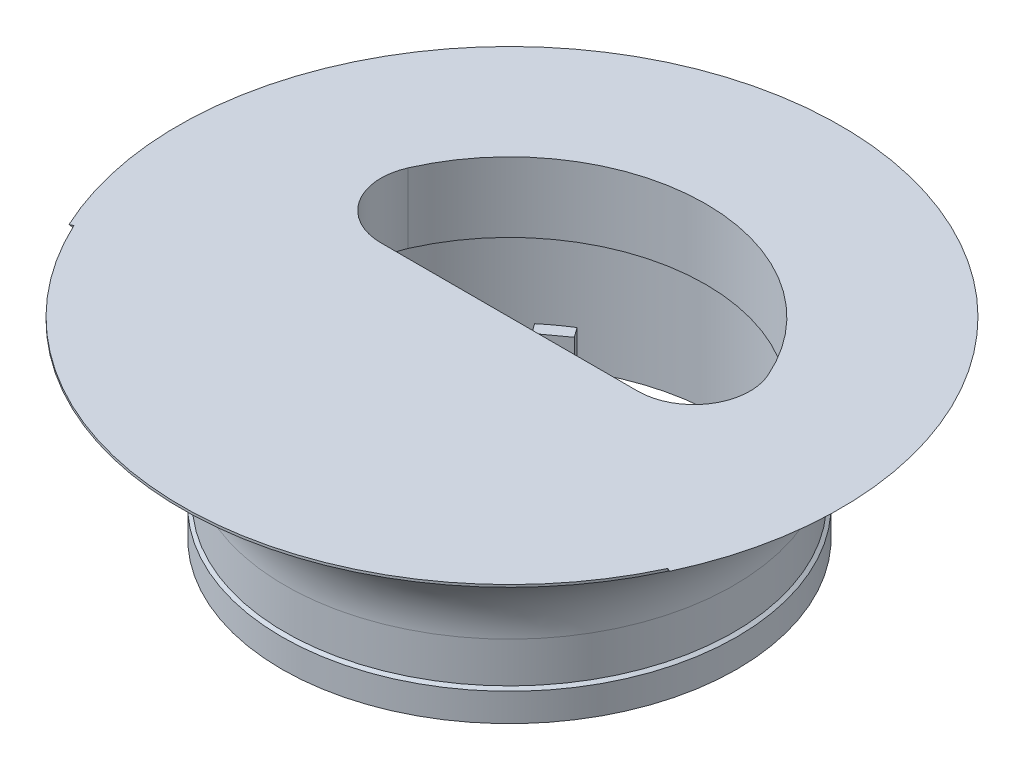
ISO-10303-21;
HEADER;
FILE_DESCRIPTION(('STEP AP214'),'2;1');
FILE_NAME('part.step','',(''),(''),'','','');
FILE_SCHEMA(('AUTOMOTIVE_DESIGN { 1 0 10303 214 1 1 1 1 }'));
ENDSEC;
DATA;
#1=APPLICATION_CONTEXT('core data for automotive mechanical design processes');
#2=APPLICATION_PROTOCOL_DEFINITION('international standard','automotive_design',2000,#1);
#3=PRODUCT_CONTEXT('',#1,'mechanical');
#4=PRODUCT('Part','Part','',(#3));
#5=PRODUCT_RELATED_PRODUCT_CATEGORY('part','',(#4));
#6=PRODUCT_DEFINITION_FORMATION('','',#4);
#7=PRODUCT_DEFINITION_CONTEXT('part definition',#1,'design');
#8=PRODUCT_DEFINITION('design','',#6,#7);
#9=PRODUCT_DEFINITION_SHAPE('','',#8);
#10=(LENGTH_UNIT() NAMED_UNIT(*) SI_UNIT(.MILLI.,.METRE.));
#11=(NAMED_UNIT(*) PLANE_ANGLE_UNIT() SI_UNIT($,.RADIAN.));
#12=(NAMED_UNIT(*) SI_UNIT($,.STERADIAN.) SOLID_ANGLE_UNIT());
#13=UNCERTAINTY_MEASURE_WITH_UNIT(LENGTH_MEASURE(1.E-05),#10,'distance_accuracy_value','');
#14=(GEOMETRIC_REPRESENTATION_CONTEXT(3) GLOBAL_UNCERTAINTY_ASSIGNED_CONTEXT((#13)) GLOBAL_UNIT_ASSIGNED_CONTEXT((#10,
#11,#12)) REPRESENTATION_CONTEXT('',''));
#15=CARTESIAN_POINT('',(0.,0.,0.));
#16=DIRECTION('',(0.,0.,1.));
#17=DIRECTION('',(1.,0.,0.));
#18=AXIS2_PLACEMENT_3D('',#15,#16,#17);
#19=CARTESIAN_POINT('',(0.,20.46905774355,0.));
#20=DIRECTION('',(0.,1.,0.));
#21=DIRECTION('',(0.,0.,1.));
#22=AXIS2_PLACEMENT_3D('',#19,#20,#21);
#23=PLANE('',#22);
#24=DIRECTION('',(-0.906307787036651,0.,-0.422618261740697));
#25=VECTOR('',#24,1.);
#26=CARTESIAN_POINT('',(0.,20.46905774355,0.));
#27=LINE('',#26,#25);
#28=CARTESIAN_POINT('',(32.1378013524586,20.46905774355,14.9861028869154));
#29=VERTEX_POINT('',#28);
#30=CARTESIAN_POINT('',(31.7794250088725,20.46905774355,14.8189892533996));
#31=VERTEX_POINT('',#30);
#32=EDGE_CURVE('E242',#29,#31,#27,.T.);
#33=ORIENTED_EDGE('',*,*,#32,.F.);
#34=CARTESIAN_POINT('',(0.,20.46905774355,0.));
#35=DIRECTION('',(0.,-1.,0.));
#36=DIRECTION('',(0.,0.,-1.));
#37=AXIS2_PLACEMENT_3D('',#34,#35,#36);
#38=CIRCLE('',#37,35.4601403763057);
#39=CARTESIAN_POINT('',(-32.1378013524586,20.46905774355,14.9861028869154));
#40=VERTEX_POINT('',#39);
#41=EDGE_CURVE('E257',#40,#29,#38,.T.);
#42=ORIENTED_EDGE('',*,*,#41,.F.);
#43=DIRECTION('',(0.906307787036651,0.,-0.422618261740697));
#44=VECTOR('',#43,1.);
#45=CARTESIAN_POINT('',(0.,20.46905774355,0.));
#46=LINE('',#45,#44);
#47=CARTESIAN_POINT('',(-31.7794250088725,20.46905774355,14.8189892533996));
#48=VERTEX_POINT('',#47);
#49=EDGE_CURVE('E281',#40,#48,#46,.T.);
#50=ORIENTED_EDGE('',*,*,#49,.T.);
#51=CARTESIAN_POINT('',(0.,20.46905774355,0.));
#52=DIRECTION('',(0.,1.,0.));
#53=DIRECTION('',(0.,0.,1.));
#54=AXIS2_PLACEMENT_3D('',#51,#52,#53);
#55=CIRCLE('',#54,35.0647158321143);
#56=EDGE_CURVE('E259',#48,#31,#55,.T.);
#57=ORIENTED_EDGE('',*,*,#56,.T.);
#58=EDGE_LOOP('',(#33,#42,#50,#57));
#59=FACE_BOUND('',#58,.T.);
#60=DIRECTION('',(-1.,0.,0.));
#61=VECTOR('',#60,1.);
#62=CARTESIAN_POINT('',(21.,20.46905774355,0.));
#63=LINE('',#62,#61);
#64=CARTESIAN_POINT('',(13.7477270848675,20.46905774355,0.));
#65=VERTEX_POINT('',#64);
#66=CARTESIAN_POINT('',(-13.7477270848675,20.46905774355,0.));
#67=VERTEX_POINT('',#66);
#68=EDGE_CURVE('E262',#65,#67,#63,.T.);
#69=ORIENTED_EDGE('',*,*,#68,.T.);
#70=CARTESIAN_POINT('',(-13.7477270848675,20.46905774355,-6.));
#71=DIRECTION('',(0.,1.,0.));
#72=DIRECTION('',(0.,0.,1.));
#73=AXIS2_PLACEMENT_3D('',#70,#71,#72);
#74=CIRCLE('',#73,6.);
#75=CARTESIAN_POINT('',(-19.2468179188145,20.46905774355,-8.4));
#76=VERTEX_POINT('',#75);
#77=EDGE_CURVE('E288',#67,#76,#74,.F.);
#78=ORIENTED_EDGE('',*,*,#77,.T.);
#79=CARTESIAN_POINT('',(0.,20.46905774355,0.));
#80=DIRECTION('',(0.,1.,0.));
#81=DIRECTION('',(0.,0.,1.));
#82=AXIS2_PLACEMENT_3D('',#79,#80,#81);
#83=CIRCLE('',#82,21.);
#84=CARTESIAN_POINT('',(19.2468179188145,20.46905774355,-8.4));
#85=VERTEX_POINT('',#84);
#86=EDGE_CURVE('E285',#76,#85,#83,.F.);
#87=ORIENTED_EDGE('',*,*,#86,.T.);
#88=CARTESIAN_POINT('',(13.7477270848675,20.46905774355,-6.));
#89=DIRECTION('',(0.,1.,0.));
#90=DIRECTION('',(0.,0.,1.));
#91=AXIS2_PLACEMENT_3D('',#88,#89,#90);
#92=CIRCLE('',#91,6.);
#93=EDGE_CURVE('E65',#85,#65,#92,.F.);
#94=ORIENTED_EDGE('',*,*,#93,.T.);
#95=EDGE_LOOP('',(#69,#78,#87,#94));
#96=FACE_BOUND('',#95,.T.);
#97=ADVANCED_FACE('F62',(#59,#96),#23,.T.);
#98=CARTESIAN_POINT('',(21.,73.,0.));
#99=DIRECTION('',(0.,0.,1.));
#100=DIRECTION('',(1.,0.,0.));
#101=AXIS2_PLACEMENT_3D('',#98,#99,#100);
#102=PLANE('',#101);
#103=ORIENTED_EDGE('',*,*,#68,.F.);
#104=DIRECTION('',(0.,1.,0.));
#105=VECTOR('',#104,1.);
#106=CARTESIAN_POINT('',(13.7477270848675,13.,0.));
#107=LINE('',#106,#105);
#108=CARTESIAN_POINT('',(13.7477270848675,13.,0.));
#109=VERTEX_POINT('',#108);
#110=EDGE_CURVE('E303',#65,#109,#107,.F.);
#111=ORIENTED_EDGE('',*,*,#110,.T.);
#112=DIRECTION('',(-1.,0.,0.));
#113=VECTOR('',#112,1.);
#114=CARTESIAN_POINT('',(21.,13.,0.));
#115=LINE('',#114,#113);
#116=CARTESIAN_POINT('',(-13.7477270848675,13.,0.));
#117=VERTEX_POINT('',#116);
#118=EDGE_CURVE('E313',#109,#117,#115,.T.);
#119=ORIENTED_EDGE('',*,*,#118,.T.);
#120=DIRECTION('',(0.,1.,0.));
#121=VECTOR('',#120,1.);
#122=CARTESIAN_POINT('',(-13.7477270848675,58.4278760968654,0.));
#123=LINE('',#122,#121);
#124=EDGE_CURVE('E309',#117,#67,#123,.T.);
#125=ORIENTED_EDGE('',*,*,#124,.T.);
#126=EDGE_LOOP('',(#103,#111,#119,#125));
#127=FACE_BOUND('',#126,.T.);
#128=ADVANCED_FACE('F311',(#127),#102,.F.);
#129=CARTESIAN_POINT('',(0.,73.,0.));
#130=DIRECTION('',(0.,-1.,0.));
#131=DIRECTION('',(0.,0.,-1.));
#132=AXIS2_PLACEMENT_3D('',#129,#130,#131);
#133=CYLINDRICAL_SURFACE('',#132,21.);
#134=ORIENTED_EDGE('',*,*,#86,.F.);
#135=DIRECTION('',(0.,-1.,0.));
#136=VECTOR('',#135,1.);
#137=CARTESIAN_POINT('',(-19.2468179188145,73.,-8.4));
#138=LINE('',#137,#136);
#139=CARTESIAN_POINT('',(-19.2468179188145,13.,-8.4));
#140=VERTEX_POINT('',#139);
#141=EDGE_CURVE('E308',#76,#140,#138,.T.);
#142=ORIENTED_EDGE('',*,*,#141,.T.);
#143=CARTESIAN_POINT('',(0.,13.,0.));
#144=DIRECTION('',(0.,-1.,0.));
#145=DIRECTION('',(0.,0.,1.));
#146=AXIS2_PLACEMENT_3D('',#143,#144,#145);
#147=CIRCLE('',#146,21.);
#148=CARTESIAN_POINT('',(19.2468179188145,13.,-8.4));
#149=VERTEX_POINT('',#148);
#150=EDGE_CURVE('E380',#140,#149,#147,.T.);
#151=ORIENTED_EDGE('',*,*,#150,.T.);
#152=DIRECTION('',(0.,-1.,0.));
#153=VECTOR('',#152,1.);
#154=CARTESIAN_POINT('',(19.2468179188145,73.,-8.4));
#155=LINE('',#154,#153);
#156=EDGE_CURVE('E302',#149,#85,#155,.F.);
#157=ORIENTED_EDGE('',*,*,#156,.T.);
#158=EDGE_LOOP('',(#134,#142,#151,#157));
#159=FACE_BOUND('',#158,.T.);
#160=ADVANCED_FACE('F603',(#159),#133,.F.);
#161=CARTESIAN_POINT('',(0.,0.,0.));
#162=DIRECTION('',(0.,-1.,0.));
#163=DIRECTION('',(0.,0.,-1.));
#164=AXIS2_PLACEMENT_3D('',#161,#162,#163);
#165=CYLINDRICAL_SURFACE('',#164,35.0647158321143);
#166=ORIENTED_EDGE('',*,*,#56,.F.);
#167=DIRECTION('',(0.,-1.,0.));
#168=VECTOR('',#167,1.);
#169=CARTESIAN_POINT('',(-31.7794250088725,55.4278760968653,14.8189892533996));
#170=LINE('',#169,#168);
#171=CARTESIAN_POINT('',(-31.7794250088725,20.2113428590195,14.8189892533996));
#172=VERTEX_POINT('',#171);
#173=EDGE_CURVE('E330',#48,#172,#170,.T.);
#174=ORIENTED_EDGE('',*,*,#173,.T.);
#175=CARTESIAN_POINT('',(0.,20.2113428590195,0.));
#176=DIRECTION('',(0.,1.,0.));
#177=DIRECTION('',(0.,0.,1.));
#178=AXIS2_PLACEMENT_3D('',#175,#176,#177);
#179=CIRCLE('',#178,35.0647158321143);
#180=CARTESIAN_POINT('',(31.7794250088725,20.2113428590195,14.8189892533996));
#181=VERTEX_POINT('',#180);
#182=EDGE_CURVE('E250',#172,#181,#179,.T.);
#183=ORIENTED_EDGE('',*,*,#182,.T.);
#184=DIRECTION('',(0.,-1.,0.));
#185=VECTOR('',#184,1.);
#186=CARTESIAN_POINT('',(31.7794250088725,55.4278760968653,14.8189892533996));
#187=LINE('',#186,#185);
#188=EDGE_CURVE('E243',#31,#181,#187,.T.);
#189=ORIENTED_EDGE('',*,*,#188,.F.);
#190=EDGE_LOOP('',(#166,#174,#183,#189));
#191=FACE_BOUND('',#190,.T.);
#192=ADVANCED_FACE('F609',(#191),#165,.T.);
#193=CARTESIAN_POINT('',(0.,0.,0.));
#194=DIRECTION('',(-0.422618261740697,0.,0.906307787036651));
#195=DIRECTION('',(0.906307787036651,0.,0.422618261740697));
#196=AXIS2_PLACEMENT_3D('',#193,#194,#195);
#197=PLANE('',#196);
#198=DIRECTION('',(0.759282936681099,0.54601403763057,0.354059448080811));
#199=VECTOR('',#198,1.);
#200=CARTESIAN_POINT('',(0.,-2.64181414529798,0.));
#201=LINE('',#200,#199);
#202=EDGE_CURVE('E239',#29,#181,#201,.F.);
#203=ORIENTED_EDGE('',*,*,#202,.F.);
#204=ORIENTED_EDGE('',*,*,#32,.T.);
#205=ORIENTED_EDGE('',*,*,#188,.T.);
#206=EDGE_LOOP('',(#203,#204,#205));
#207=FACE_BOUND('',#206,.T.);
#208=ADVANCED_FACE('F241',(#207),#197,.T.);
#209=CARTESIAN_POINT('',(0.,0.,0.));
#210=DIRECTION('',(-0.422618261740697,0.,-0.906307787036651));
#211=DIRECTION('',(-0.906307787036651,0.,0.422618261740697));
#212=AXIS2_PLACEMENT_3D('',#209,#210,#211);
#213=PLANE('',#212);
#214=ORIENTED_EDGE('',*,*,#49,.F.);
#215=DIRECTION('',(-0.759282936681099,0.54601403763057,0.354059448080811));
#216=VECTOR('',#215,1.);
#217=CARTESIAN_POINT('',(0.,-2.64181414529798,0.));
#218=LINE('',#217,#216);
#219=EDGE_CURVE('E249',#40,#172,#218,.F.);
#220=ORIENTED_EDGE('',*,*,#219,.T.);
#221=ORIENTED_EDGE('',*,*,#173,.F.);
#222=EDGE_LOOP('',(#214,#220,#221));
#223=FACE_BOUND('',#222,.T.);
#224=ADVANCED_FACE('F622',(#223),#213,.F.);
#225=CARTESIAN_POINT('',(-13.7477270848675,73.,-6.));
#226=DIRECTION('',(0.,-1.,0.));
#227=DIRECTION('',(0.,0.,-1.));
#228=AXIS2_PLACEMENT_3D('',#225,#226,#227);
#229=CYLINDRICAL_SURFACE('',#228,6.);
#230=ORIENTED_EDGE('',*,*,#77,.F.);
#231=ORIENTED_EDGE('',*,*,#124,.F.);
#232=CARTESIAN_POINT('',(-13.7477270848675,13.,-6.));
#233=DIRECTION('',(0.,-1.,0.));
#234=DIRECTION('',(0.,0.,-1.));
#235=AXIS2_PLACEMENT_3D('',#232,#233,#234);
#236=CIRCLE('',#235,6.);
#237=EDGE_CURVE('E317',#140,#117,#236,.F.);
#238=ORIENTED_EDGE('',*,*,#237,.F.);
#239=ORIENTED_EDGE('',*,*,#141,.F.);
#240=EDGE_LOOP('',(#230,#231,#238,#239));
#241=FACE_BOUND('',#240,.T.);
#242=ADVANCED_FACE('F619',(#241),#229,.F.);
#243=CARTESIAN_POINT('',(13.7477270848675,73.,-6.));
#244=DIRECTION('',(0.,-1.,0.));
#245=DIRECTION('',(0.,0.,-1.));
#246=AXIS2_PLACEMENT_3D('',#243,#244,#245);
#247=CYLINDRICAL_SURFACE('',#246,6.);
#248=ORIENTED_EDGE('',*,*,#93,.F.);
#249=ORIENTED_EDGE('',*,*,#156,.F.);
#250=CARTESIAN_POINT('',(13.7477270848675,13.,-6.));
#251=DIRECTION('',(0.,-1.,0.));
#252=DIRECTION('',(0.,0.,-1.));
#253=AXIS2_PLACEMENT_3D('',#250,#251,#252);
#254=CIRCLE('',#253,6.);
#255=EDGE_CURVE('E261',#109,#149,#254,.F.);
#256=ORIENTED_EDGE('',*,*,#255,.F.);
#257=ORIENTED_EDGE('',*,*,#110,.F.);
#258=EDGE_LOOP('',(#248,#249,#256,#257));
#259=FACE_BOUND('',#258,.T.);
#260=ADVANCED_FACE('F300',(#259),#247,.F.);
#261=CARTESIAN_POINT('',(0.,0.,0.));
#262=DIRECTION('',(0.,-1.,0.));
#263=DIRECTION('',(0.,0.,-1.));
#264=AXIS2_PLACEMENT_3D('',#261,#262,#263);
#265=CYLINDRICAL_SURFACE('',#264,22.5);
#266=CARTESIAN_POINT('',(0.,12.5,0.));
#267=DIRECTION('',(0.,-1.,0.));
#268=DIRECTION('',(0.,0.,-1.));
#269=AXIS2_PLACEMENT_3D('',#266,#267,#268);
#270=CIRCLE('',#269,22.5);
#271=CARTESIAN_POINT('',(0.,12.5,-22.5));
#272=VERTEX_POINT('',#271);
#273=EDGE_CURVE('E277',#272,#272,#270,.T.);
#274=ORIENTED_EDGE('',*,*,#273,.F.);
#275=EDGE_LOOP('',(#274));
#276=FACE_BOUND('',#275,.T.);
#277=DIRECTION('',(0.,-1.,0.));
#278=VECTOR('',#277,1.);
#279=CARTESIAN_POINT('',(21.845042742334,0.,5.38925853764709));
#280=LINE('',#279,#278);
#281=CARTESIAN_POINT('',(21.845042742334,0.,5.38925853764709));
#282=VERTEX_POINT('',#281);
#283=CARTESIAN_POINT('',(21.845042742334,4.,5.38925853764709));
#284=VERTEX_POINT('',#283);
#285=EDGE_CURVE('E533',#282,#284,#280,.F.);
#286=ORIENTED_EDGE('',*,*,#285,.T.);
#287=CARTESIAN_POINT('',(0.,4.,0.));
#288=DIRECTION('',(0.,-1.,0.));
#289=DIRECTION('',(0.,0.,-1.));
#290=AXIS2_PLACEMENT_3D('',#287,#288,#289);
#291=CIRCLE('',#290,22.5);
#292=CARTESIAN_POINT('',(20.8407375106154,4.,8.48019221560633));
#293=VERTEX_POINT('',#292);
#294=EDGE_CURVE('E327',#284,#293,#291,.T.);
#295=ORIENTED_EDGE('',*,*,#294,.T.);
#296=DIRECTION('',(0.,-1.,0.));
#297=VECTOR('',#296,1.);
#298=CARTESIAN_POINT('',(20.8407375106154,0.,8.48019221560633));
#299=LINE('',#298,#297);
#300=CARTESIAN_POINT('',(20.8407375106154,0.,8.48019221560633));
#301=VERTEX_POINT('',#300);
#302=EDGE_CURVE('E530',#293,#301,#299,.T.);
#303=ORIENTED_EDGE('',*,*,#302,.T.);
#304=CARTESIAN_POINT('',(0.,0.,0.));
#305=DIRECTION('',(0.,-1.,0.));
#306=DIRECTION('',(0.,0.,-1.));
#307=AXIS2_PLACEMENT_3D('',#304,#305,#306);
#308=CIRCLE('',#307,22.5);
#309=CARTESIAN_POINT('',(1.625,0.,22.4412427240561));
#310=VERTEX_POINT('',#309);
#311=EDGE_CURVE('E377',#301,#310,#308,.T.);
#312=ORIENTED_EDGE('',*,*,#311,.T.);
#313=DIRECTION('',(0.,-1.,0.));
#314=VECTOR('',#313,1.);
#315=CARTESIAN_POINT('',(1.625,0.,22.4412427240561));
#316=LINE('',#315,#314);
#317=CARTESIAN_POINT('',(1.625,4.,22.4412427240561));
#318=VERTEX_POINT('',#317);
#319=EDGE_CURVE('E389',#310,#318,#316,.F.);
#320=ORIENTED_EDGE('',*,*,#319,.T.);
#321=CARTESIAN_POINT('',(0.,4.,0.));
#322=DIRECTION('',(0.,-1.,0.));
#323=DIRECTION('',(0.,0.,-1.));
#324=AXIS2_PLACEMENT_3D('',#321,#322,#323);
#325=CIRCLE('',#324,22.5);
#326=CARTESIAN_POINT('',(-1.625,4.,22.4412427240561));
#327=VERTEX_POINT('',#326);
#328=EDGE_CURVE('E352',#318,#327,#325,.T.);
#329=ORIENTED_EDGE('',*,*,#328,.T.);
#330=DIRECTION('',(0.,-1.,0.));
#331=VECTOR('',#330,1.);
#332=CARTESIAN_POINT('',(-1.625,0.,22.4412427240561));
#333=LINE('',#332,#331);
#334=CARTESIAN_POINT('',(-1.625,0.,22.4412427240561));
#335=VERTEX_POINT('',#334);
#336=EDGE_CURVE('E333',#327,#335,#333,.T.);
#337=ORIENTED_EDGE('',*,*,#336,.T.);
#338=CARTESIAN_POINT('',(-20.8407375106155,0.,8.48019221560603));
#339=VERTEX_POINT('',#338);
#340=EDGE_CURVE('E373',#335,#339,#308,.T.);
#341=ORIENTED_EDGE('',*,*,#340,.T.);
#342=DIRECTION('',(0.,-1.,0.));
#343=VECTOR('',#342,1.);
#344=CARTESIAN_POINT('',(-20.8407375106155,0.,8.48019221560603));
#345=LINE('',#344,#343);
#346=CARTESIAN_POINT('',(-20.8407375106155,4.,8.48019221560603));
#347=VERTEX_POINT('',#346);
#348=EDGE_CURVE('E425',#339,#347,#345,.F.);
#349=ORIENTED_EDGE('',*,*,#348,.T.);
#350=CARTESIAN_POINT('',(0.,4.,0.));
#351=DIRECTION('',(0.,-1.,0.));
#352=DIRECTION('',(0.,0.,-1.));
#353=AXIS2_PLACEMENT_3D('',#350,#351,#352);
#354=CIRCLE('',#353,22.5);
#355=CARTESIAN_POINT('',(-21.845042742334,4.,5.38925853764678));
#356=VERTEX_POINT('',#355);
#357=EDGE_CURVE('E349',#347,#356,#354,.T.);
#358=ORIENTED_EDGE('',*,*,#357,.T.);
#359=DIRECTION('',(0.,-1.,0.));
#360=VECTOR('',#359,1.);
#361=CARTESIAN_POINT('',(-21.845042742334,0.,5.38925853764678));
#362=LINE('',#361,#360);
#363=CARTESIAN_POINT('',(-21.845042742334,0.,5.38925853764678));
#364=VERTEX_POINT('',#363);
#365=EDGE_CURVE('E422',#356,#364,#362,.T.);
#366=ORIENTED_EDGE('',*,*,#365,.T.);
#367=CARTESIAN_POINT('',(-14.5052841321751,0.,-17.2001957036793));
#368=VERTEX_POINT('',#367);
#369=EDGE_CURVE('E376',#364,#368,#308,.T.);
#370=ORIENTED_EDGE('',*,*,#369,.T.);
#371=DIRECTION('',(0.,-1.,0.));
#372=VECTOR('',#371,1.);
#373=CARTESIAN_POINT('',(-14.5052841321751,0.,-17.2001957036793));
#374=LINE('',#373,#372);
#375=CARTESIAN_POINT('',(-14.5052841321751,4.,-17.2001957036793));
#376=VERTEX_POINT('',#375);
#377=EDGE_CURVE('E461',#368,#376,#374,.F.);
#378=ORIENTED_EDGE('',*,*,#377,.T.);
#379=CARTESIAN_POINT('',(0.,4.,0.));
#380=DIRECTION('',(0.,-1.,0.));
#381=DIRECTION('',(0.,0.,-1.));
#382=AXIS2_PLACEMENT_3D('',#379,#380,#381);
#383=CIRCLE('',#382,22.5);
#384=CARTESIAN_POINT('',(-11.8759789004565,4.,-19.1104977736298));
#385=VERTEX_POINT('',#384);
#386=EDGE_CURVE('E346',#376,#385,#383,.T.);
#387=ORIENTED_EDGE('',*,*,#386,.T.);
#388=DIRECTION('',(0.,-1.,0.));
#389=VECTOR('',#388,1.);
#390=CARTESIAN_POINT('',(-11.8759789004565,0.,-19.1104977736298));
#391=LINE('',#390,#389);
#392=CARTESIAN_POINT('',(-11.8759789004565,0.,-19.1104977736298));
#393=VERTEX_POINT('',#392);
#394=EDGE_CURVE('E458',#385,#393,#391,.T.);
#395=ORIENTED_EDGE('',*,*,#394,.T.);
#396=CARTESIAN_POINT('',(11.8759789004568,0.,-19.1104977736297));
#397=VERTEX_POINT('',#396);
#398=EDGE_CURVE('E562',#393,#397,#308,.T.);
#399=ORIENTED_EDGE('',*,*,#398,.T.);
#400=DIRECTION('',(0.,-1.,0.));
#401=VECTOR('',#400,1.);
#402=CARTESIAN_POINT('',(11.8759789004568,0.,-19.1104977736297));
#403=LINE('',#402,#401);
#404=CARTESIAN_POINT('',(11.8759789004568,4.,-19.1104977736297));
#405=VERTEX_POINT('',#404);
#406=EDGE_CURVE('E497',#397,#405,#403,.F.);
#407=ORIENTED_EDGE('',*,*,#406,.T.);
#408=CARTESIAN_POINT('',(0.,4.,0.));
#409=DIRECTION('',(0.,-1.,0.));
#410=DIRECTION('',(0.,0.,-1.));
#411=AXIS2_PLACEMENT_3D('',#408,#409,#410);
#412=CIRCLE('',#411,22.5);
#413=CARTESIAN_POINT('',(14.5052841321754,4.,-17.2001957036791));
#414=VERTEX_POINT('',#413);
#415=EDGE_CURVE('E343',#405,#414,#412,.T.);
#416=ORIENTED_EDGE('',*,*,#415,.T.);
#417=DIRECTION('',(0.,-1.,0.));
#418=VECTOR('',#417,1.);
#419=CARTESIAN_POINT('',(14.5052841321754,0.,-17.2001957036791));
#420=LINE('',#419,#418);
#421=CARTESIAN_POINT('',(14.5052841321754,0.,-17.2001957036791));
#422=VERTEX_POINT('',#421);
#423=EDGE_CURVE('E494',#414,#422,#420,.T.);
#424=ORIENTED_EDGE('',*,*,#423,.T.);
#425=EDGE_CURVE('E560',#422,#282,#308,.T.);
#426=ORIENTED_EDGE('',*,*,#425,.T.);
#427=EDGE_LOOP('',(#286,#295,#303,#312,#320,#329,#337,#341,#349,#358,#366,#370,#378,#387,#395,
#399,#407,#416,#424,#426));
#428=FACE_BOUND('',#427,.T.);
#429=ADVANCED_FACE('F567',(#276,#428),#265,.F.);
#430=CARTESIAN_POINT('',(0.,15.9588183533154,0.));
#431=DIRECTION('',(0.,1.,0.));
#432=DIRECTION('',(0.,0.,1.));
#433=AXIS2_PLACEMENT_3D('',#430,#431,#432);
#434=CONICAL_SURFACE('',#433,28.5398596236943,0.993197296529965);
#435=CARTESIAN_POINT('',(0.,15.9588183533154,0.));
#436=DIRECTION('',(0.,-1.,0.));
#437=DIRECTION('',(0.,0.,-1.));
#438=AXIS2_PLACEMENT_3D('',#435,#436,#437);
#439=CIRCLE('',#438,28.5398596236943);
#440=CARTESIAN_POINT('',(0.,15.9588183533154,-28.5398596236943));
#441=VERTEX_POINT('',#440);
#442=EDGE_CURVE('E268',#441,#441,#439,.T.);
#443=ORIENTED_EDGE('',*,*,#442,.F.);
#444=EDGE_LOOP('',(#443));
#445=FACE_BOUND('',#444,.T.);
#446=ORIENTED_EDGE('',*,*,#41,.T.);
#447=ORIENTED_EDGE('',*,*,#202,.T.);
#448=ORIENTED_EDGE('',*,*,#182,.F.);
#449=ORIENTED_EDGE('',*,*,#219,.F.);
#450=EDGE_LOOP('',(#446,#447,#448,#449));
#451=FACE_BOUND('',#450,.T.);
#452=ADVANCED_FACE('F264',(#445,#451),#434,.T.);
#453=CARTESIAN_POINT('',(0.,12.5,0.));
#454=DIRECTION('',(0.,-1.,0.));
#455=DIRECTION('',(0.,0.,-1.));
#456=AXIS2_PLACEMENT_3D('',#453,#454,#455);
#457=TOROIDAL_SURFACE('',#456,22.,0.5);
#458=ORIENTED_EDGE('',*,*,#273,.T.);
#459=EDGE_LOOP('',(#458));
#460=FACE_BOUND('',#459,.T.);
#461=CARTESIAN_POINT('',(0.,13.,0.));
#462=DIRECTION('',(0.,-1.,0.));
#463=DIRECTION('',(0.,0.,-1.));
#464=AXIS2_PLACEMENT_3D('',#461,#462,#463);
#465=CIRCLE('',#464,22.);
#466=CARTESIAN_POINT('',(0.,13.,-22.));
#467=VERTEX_POINT('',#466);
#468=EDGE_CURVE('E269',#467,#467,#465,.T.);
#469=ORIENTED_EDGE('',*,*,#468,.F.);
#470=EDGE_LOOP('',(#469));
#471=FACE_BOUND('',#470,.T.);
#472=ADVANCED_FACE('F668',(#460,#471),#457,.F.);
#473=CARTESIAN_POINT('',(0.,13.,0.));
#474=DIRECTION('',(0.,-1.,0.));
#475=DIRECTION('',(0.,0.,-1.));
#476=AXIS2_PLACEMENT_3D('',#473,#474,#475);
#477=PLANE('',#476);
#478=ORIENTED_EDGE('',*,*,#150,.F.);
#479=ORIENTED_EDGE('',*,*,#237,.T.);
#480=ORIENTED_EDGE('',*,*,#118,.F.);
#481=ORIENTED_EDGE('',*,*,#255,.T.);
#482=EDGE_LOOP('',(#478,#479,#480,#481));
#483=FACE_BOUND('',#482,.T.);
#484=ORIENTED_EDGE('',*,*,#468,.T.);
#485=EDGE_LOOP('',(#484));
#486=FACE_BOUND('',#485,.T.);
#487=ADVANCED_FACE('F680',(#483,#486),#477,.T.);
#488=CARTESIAN_POINT('',(0.,7.58105808752617,0.));
#489=DIRECTION('',(0.,-1.,0.));
#490=DIRECTION('',(0.,0.,-1.));
#491=AXIS2_PLACEMENT_3D('',#488,#489,#490);
#492=TOROIDAL_SURFACE('',#491,34.,10.);
#493=ORIENTED_EDGE('',*,*,#442,.T.);
#494=EDGE_LOOP('',(#493));
#495=FACE_BOUND('',#494,.T.);
#496=CARTESIAN_POINT('',(0.,7.58105808752612,0.));
#497=DIRECTION('',(0.,-1.,0.));
#498=DIRECTION('',(0.,0.,-1.));
#499=AXIS2_PLACEMENT_3D('',#496,#497,#498);
#500=CIRCLE('',#499,24.);
#501=CARTESIAN_POINT('',(0.,7.58105808752612,-24.));
#502=VERTEX_POINT('',#501);
#503=EDGE_CURVE('E274',#502,#502,#500,.T.);
#504=ORIENTED_EDGE('',*,*,#503,.F.);
#505=EDGE_LOOP('',(#504));
#506=FACE_BOUND('',#505,.T.);
#507=ADVANCED_FACE('F692',(#495,#506),#492,.F.);
#508=CARTESIAN_POINT('',(0.,0.,0.));
#509=DIRECTION('',(0.,-1.,0.));
#510=DIRECTION('',(0.,0.,-1.));
#511=AXIS2_PLACEMENT_3D('',#508,#509,#510);
#512=CYLINDRICAL_SURFACE('',#511,24.);
#513=ORIENTED_EDGE('',*,*,#503,.T.);
#514=EDGE_LOOP('',(#513));
#515=FACE_BOUND('',#514,.T.);
#516=CARTESIAN_POINT('',(0.,3.25,0.));
#517=DIRECTION('',(0.,-1.,0.));
#518=DIRECTION('',(0.,0.,-1.));
#519=AXIS2_PLACEMENT_3D('',#516,#517,#518);
#520=CIRCLE('',#519,24.);
#521=CARTESIAN_POINT('',(0.,3.25,-24.));
#522=VERTEX_POINT('',#521);
#523=EDGE_CURVE('E361',#522,#522,#520,.T.);
#524=ORIENTED_EDGE('',*,*,#523,.F.);
#525=EDGE_LOOP('',(#524));
#526=FACE_BOUND('',#525,.T.);
#527=ADVANCED_FACE('F702',(#515,#526),#512,.T.);
#528=CARTESIAN_POINT('',(0.,3.,0.));
#529=DIRECTION('',(0.,-1.,0.));
#530=DIRECTION('',(0.,0.,-1.));
#531=AXIS2_PLACEMENT_3D('',#528,#529,#530);
#532=CONICAL_SURFACE('',#531,24.35,0.950546840812071);
#533=ORIENTED_EDGE('',*,*,#523,.T.);
#534=EDGE_LOOP('',(#533));
#535=FACE_BOUND('',#534,.T.);
#536=CARTESIAN_POINT('',(0.,3.,0.));
#537=DIRECTION('',(0.,-1.,0.));
#538=DIRECTION('',(0.,0.,-1.));
#539=AXIS2_PLACEMENT_3D('',#536,#537,#538);
#540=CIRCLE('',#539,24.35);
#541=CARTESIAN_POINT('',(0.,3.,-24.35));
#542=VERTEX_POINT('',#541);
#543=EDGE_CURVE('E365',#542,#542,#540,.T.);
#544=ORIENTED_EDGE('',*,*,#543,.F.);
#545=EDGE_LOOP('',(#544));
#546=FACE_BOUND('',#545,.T.);
#547=ADVANCED_FACE('F713',(#535,#546),#532,.T.);
#548=CARTESIAN_POINT('',(0.,0.,0.));
#549=DIRECTION('',(0.,-1.,0.));
#550=DIRECTION('',(0.,0.,-1.));
#551=AXIS2_PLACEMENT_3D('',#548,#549,#550);
#552=CYLINDRICAL_SURFACE('',#551,24.35);
#553=ORIENTED_EDGE('',*,*,#543,.T.);
#554=EDGE_LOOP('',(#553));
#555=FACE_BOUND('',#554,.T.);
#556=CARTESIAN_POINT('',(0.,0.,0.));
#557=DIRECTION('',(0.,-1.,0.));
#558=DIRECTION('',(0.,0.,-1.));
#559=AXIS2_PLACEMENT_3D('',#556,#557,#558);
#560=CIRCLE('',#559,24.35);
#561=CARTESIAN_POINT('',(0.,0.,-24.35));
#562=VERTEX_POINT('',#561);
#563=EDGE_CURVE('E369',#562,#562,#560,.T.);
#564=ORIENTED_EDGE('',*,*,#563,.F.);
#565=EDGE_LOOP('',(#564));
#566=FACE_BOUND('',#565,.T.);
#567=ADVANCED_FACE('F724',(#555,#566),#552,.T.);
#568=CARTESIAN_POINT('',(22.5,0.,0.));
#569=DIRECTION('',(0.,-1.,0.));
#570=DIRECTION('',(0.,0.,-1.));
#571=AXIS2_PLACEMENT_3D('',#568,#569,#570);
#572=PLANE('',#571);
#573=ORIENTED_EDGE('',*,*,#311,.F.);
#574=DIRECTION('',(0.95105651629515,0.,0.309016994374958));
#575=VECTOR('',#574,1.);
#576=CARTESIAN_POINT('',(19.6126927037831,0.,8.08117627000999));
#577=LINE('',#576,#575);
#578=CARTESIAN_POINT('',(19.6126927037831,0.,8.08117627000999));
#579=VERTEX_POINT('',#578);
#580=EDGE_CURVE('E548',#579,#301,#577,.T.);
#581=ORIENTED_EDGE('',*,*,#580,.F.);
#582=DIRECTION('',(-0.309016994374958,0.,0.95105651629515));
#583=VECTOR('',#582,1.);
#584=CARTESIAN_POINT('',(20.6169979355017,0.,4.99024259205075));
#585=LINE('',#584,#583);
#586=CARTESIAN_POINT('',(20.6169979355017,0.,4.99024259205075));
#587=VERTEX_POINT('',#586);
#588=EDGE_CURVE('E552',#587,#579,#585,.T.);
#589=ORIENTED_EDGE('',*,*,#588,.F.);
#590=DIRECTION('',(0.95105651629515,0.,0.309016994374958));
#591=VECTOR('',#590,1.);
#592=CARTESIAN_POINT('',(20.6169979355017,0.,4.99024259205075));
#593=LINE('',#592,#591);
#594=EDGE_CURVE('E544',#587,#282,#593,.T.);
#595=ORIENTED_EDGE('',*,*,#594,.T.);
#596=ORIENTED_EDGE('',*,*,#425,.F.);
#597=DIRECTION('',(0.58778525229248,0.,-0.809016994374942));
#598=VECTOR('',#597,1.);
#599=CARTESIAN_POINT('',(13.7463107018452,0.,-16.1555583960547));
#600=LINE('',#599,#598);
#601=CARTESIAN_POINT('',(13.7463107018452,0.,-16.1555583960547));
#602=VERTEX_POINT('',#601);
#603=EDGE_CURVE('E513',#602,#422,#600,.T.);
#604=ORIENTED_EDGE('',*,*,#603,.F.);
#605=DIRECTION('',(0.809016994374942,0.,0.58778525229248));
#606=VECTOR('',#605,1.);
#607=CARTESIAN_POINT('',(11.1170054701267,0.,-18.0658604660053));
#608=LINE('',#607,#606);
#609=CARTESIAN_POINT('',(11.1170054701267,0.,-18.0658604660053));
#610=VERTEX_POINT('',#609);
#611=EDGE_CURVE('E517',#610,#602,#608,.T.);
#612=ORIENTED_EDGE('',*,*,#611,.F.);
#613=DIRECTION('',(0.58778525229248,0.,-0.809016994374942));
#614=VECTOR('',#613,1.);
#615=CARTESIAN_POINT('',(11.1170054701267,0.,-18.0658604660053));
#616=LINE('',#615,#614);
#617=EDGE_CURVE('E509',#610,#397,#616,.T.);
#618=ORIENTED_EDGE('',*,*,#617,.T.);
#619=ORIENTED_EDGE('',*,*,#398,.F.);
#620=DIRECTION('',(-0.587785252292469,0.,-0.809016994374951));
#621=VECTOR('',#620,1.);
#622=CARTESIAN_POINT('',(-11.1170054701264,0.,-18.0658604660055));
#623=LINE('',#622,#621);
#624=CARTESIAN_POINT('',(-11.1170054701264,0.,-18.0658604660055));
#625=VERTEX_POINT('',#624);
#626=EDGE_CURVE('E477',#625,#393,#623,.T.);
#627=ORIENTED_EDGE('',*,*,#626,.F.);
#628=DIRECTION('',(0.809016994374951,0.,-0.587785252292468));
#629=VECTOR('',#628,1.);
#630=CARTESIAN_POINT('',(-13.746310701845,0.,-16.1555583960549));
#631=LINE('',#630,#629);
#632=CARTESIAN_POINT('',(-13.746310701845,0.,-16.1555583960549));
#633=VERTEX_POINT('',#632);
#634=EDGE_CURVE('E481',#633,#625,#631,.T.);
#635=ORIENTED_EDGE('',*,*,#634,.F.);
#636=DIRECTION('',(-0.587785252292469,0.,-0.809016994374951));
#637=VECTOR('',#636,1.);
#638=CARTESIAN_POINT('',(-13.746310701845,0.,-16.1555583960549));
#639=LINE('',#638,#637);
#640=EDGE_CURVE('E473',#633,#368,#639,.T.);
#641=ORIENTED_EDGE('',*,*,#640,.T.);
#642=ORIENTED_EDGE('',*,*,#369,.F.);
#643=DIRECTION('',(-0.951056516295154,0.,0.309016994374945));
#644=VECTOR('',#643,1.);
#645=CARTESIAN_POINT('',(-20.6169979355018,0.,4.99024259205045));
#646=LINE('',#645,#644);
#647=CARTESIAN_POINT('',(-20.6169979355018,0.,4.99024259205045));
#648=VERTEX_POINT('',#647);
#649=EDGE_CURVE('E441',#648,#364,#646,.T.);
#650=ORIENTED_EDGE('',*,*,#649,.F.);
#651=DIRECTION('',(-0.309016994374945,0.,-0.951056516295155));
#652=VECTOR('',#651,1.);
#653=CARTESIAN_POINT('',(-19.6126927037832,0.,8.08117627000971));
#654=LINE('',#653,#652);
#655=CARTESIAN_POINT('',(-19.6126927037832,0.,8.08117627000971));
#656=VERTEX_POINT('',#655);
#657=EDGE_CURVE('E445',#656,#648,#654,.T.);
#658=ORIENTED_EDGE('',*,*,#657,.F.);
#659=DIRECTION('',(-0.951056516295154,0.,0.309016994374945));
#660=VECTOR('',#659,1.);
#661=CARTESIAN_POINT('',(-19.6126927037832,0.,8.08117627000971));
#662=LINE('',#661,#660);
#663=EDGE_CURVE('E437',#656,#339,#662,.T.);
#664=ORIENTED_EDGE('',*,*,#663,.T.);
#665=ORIENTED_EDGE('',*,*,#340,.F.);
#666=DIRECTION('',(0.,0.,1.));
#667=VECTOR('',#666,1.);
#668=CARTESIAN_POINT('',(-1.625,0.,21.15));
#669=LINE('',#668,#667);
#670=CARTESIAN_POINT('',(-1.625,0.,21.15));
#671=VERTEX_POINT('',#670);
#672=EDGE_CURVE('E405',#671,#335,#669,.T.);
#673=ORIENTED_EDGE('',*,*,#672,.F.);
#674=DIRECTION('',(-1.,0.,0.));
#675=VECTOR('',#674,1.);
#676=CARTESIAN_POINT('',(1.625,0.,21.15));
#677=LINE('',#676,#675);
#678=CARTESIAN_POINT('',(1.625,0.,21.15));
#679=VERTEX_POINT('',#678);
#680=EDGE_CURVE('E409',#679,#671,#677,.T.);
#681=ORIENTED_EDGE('',*,*,#680,.F.);
#682=DIRECTION('',(0.,0.,1.));
#683=VECTOR('',#682,1.);
#684=CARTESIAN_POINT('',(1.625,0.,21.15));
#685=LINE('',#684,#683);
#686=EDGE_CURVE('E401',#679,#310,#685,.T.);
#687=ORIENTED_EDGE('',*,*,#686,.T.);
#688=EDGE_LOOP('',(#573,#581,#589,#595,#596,#604,#612,#618,#619,#627,#635,#641,#642,#650,#658,
#664,#665,#673,#681,#687));
#689=FACE_BOUND('',#688,.T.);
#690=ORIENTED_EDGE('',*,*,#563,.T.);
#691=EDGE_LOOP('',(#690));
#692=FACE_BOUND('',#691,.T.);
#693=ADVANCED_FACE('F578',(#689,#692),#572,.T.);
#694=CARTESIAN_POINT('',(1.625,4.,21.15));
#695=DIRECTION('',(0.,-1.,0.));
#696=DIRECTION('',(0.,0.,-1.));
#697=AXIS2_PLACEMENT_3D('',#694,#695,#696);
#698=PLANE('',#697);
#699=ORIENTED_EDGE('',*,*,#328,.F.);
#700=DIRECTION('',(0.,0.,1.));
#701=VECTOR('',#700,1.);
#702=CARTESIAN_POINT('',(1.625,4.,21.15));
#703=LINE('',#702,#701);
#704=CARTESIAN_POINT('',(1.625,4.,21.15));
#705=VERTEX_POINT('',#704);
#706=EDGE_CURVE('E397',#705,#318,#703,.T.);
#707=ORIENTED_EDGE('',*,*,#706,.F.);
#708=DIRECTION('',(1.,0.,0.));
#709=VECTOR('',#708,1.);
#710=CARTESIAN_POINT('',(1.625,4.,21.15));
#711=LINE('',#710,#709);
#712=CARTESIAN_POINT('',(-1.625,4.,21.15));
#713=VERTEX_POINT('',#712);
#714=EDGE_CURVE('E415',#713,#705,#711,.T.);
#715=ORIENTED_EDGE('',*,*,#714,.F.);
#716=DIRECTION('',(0.,0.,1.));
#717=VECTOR('',#716,1.);
#718=CARTESIAN_POINT('',(-1.625,4.,21.15));
#719=LINE('',#718,#717);
#720=EDGE_CURVE('E393',#713,#327,#719,.T.);
#721=ORIENTED_EDGE('',*,*,#720,.T.);
#722=EDGE_LOOP('',(#699,#707,#715,#721));
#723=FACE_BOUND('',#722,.T.);
#724=ADVANCED_FACE('F745',(#723),#698,.F.);
#725=CARTESIAN_POINT('',(-1.625,4.,21.15));
#726=DIRECTION('',(1.,0.,0.));
#727=DIRECTION('',(0.,1.,0.));
#728=AXIS2_PLACEMENT_3D('',#725,#726,#727);
#729=PLANE('',#728);
#730=ORIENTED_EDGE('',*,*,#336,.F.);
#731=ORIENTED_EDGE('',*,*,#720,.F.);
#732=DIRECTION('',(0.,1.,0.));
#733=VECTOR('',#732,1.);
#734=CARTESIAN_POINT('',(-1.625,4.,21.15));
#735=LINE('',#734,#733);
#736=EDGE_CURVE('E418',#671,#713,#735,.T.);
#737=ORIENTED_EDGE('',*,*,#736,.F.);
#738=ORIENTED_EDGE('',*,*,#672,.T.);
#739=EDGE_LOOP('',(#730,#731,#737,#738));
#740=FACE_BOUND('',#739,.T.);
#741=ADVANCED_FACE('F755',(#740),#729,.F.);
#742=CARTESIAN_POINT('',(1.625,4.,21.15));
#743=DIRECTION('',(-1.,0.,0.));
#744=DIRECTION('',(0.,-1.,0.));
#745=AXIS2_PLACEMENT_3D('',#742,#743,#744);
#746=PLANE('',#745);
#747=ORIENTED_EDGE('',*,*,#319,.F.);
#748=ORIENTED_EDGE('',*,*,#686,.F.);
#749=DIRECTION('',(0.,-1.,0.));
#750=VECTOR('',#749,1.);
#751=CARTESIAN_POINT('',(1.625,4.,21.15));
#752=LINE('',#751,#750);
#753=EDGE_CURVE('E412',#705,#679,#752,.T.);
#754=ORIENTED_EDGE('',*,*,#753,.F.);
#755=ORIENTED_EDGE('',*,*,#706,.T.);
#756=EDGE_LOOP('',(#747,#748,#754,#755));
#757=FACE_BOUND('',#756,.T.);
#758=ADVANCED_FACE('F766',(#757),#746,.F.);
#759=CARTESIAN_POINT('',(0.,0.,21.15));
#760=DIRECTION('',(0.,0.,-1.));
#761=DIRECTION('',(-1.,0.,0.));
#762=AXIS2_PLACEMENT_3D('',#759,#760,#761);
#763=PLANE('',#762);
#764=ORIENTED_EDGE('',*,*,#736,.T.);
#765=ORIENTED_EDGE('',*,*,#714,.T.);
#766=ORIENTED_EDGE('',*,*,#753,.T.);
#767=ORIENTED_EDGE('',*,*,#680,.T.);
#768=EDGE_LOOP('',(#764,#765,#766,#767));
#769=FACE_BOUND('',#768,.T.);
#770=ADVANCED_FACE('F777',(#769),#763,.T.);
#771=CARTESIAN_POINT('',(-19.6126927037832,4.,8.08117627000971));
#772=DIRECTION('',(0.,-1.,0.));
#773=DIRECTION('',(0.,0.,-1.));
#774=AXIS2_PLACEMENT_3D('',#771,#772,#773);
#775=PLANE('',#774);
#776=ORIENTED_EDGE('',*,*,#357,.F.);
#777=DIRECTION('',(-0.951056516295154,0.,0.309016994374945));
#778=VECTOR('',#777,1.);
#779=CARTESIAN_POINT('',(-19.6126927037832,4.,8.08117627000971));
#780=LINE('',#779,#778);
#781=CARTESIAN_POINT('',(-19.6126927037832,4.,8.08117627000971));
#782=VERTEX_POINT('',#781);
#783=EDGE_CURVE('E433',#782,#347,#780,.T.);
#784=ORIENTED_EDGE('',*,*,#783,.F.);
#785=DIRECTION('',(0.309016994374945,0.,0.951056516295155));
#786=VECTOR('',#785,1.);
#787=CARTESIAN_POINT('',(-19.6126927037832,4.,8.08117627000971));
#788=LINE('',#787,#786);
#789=CARTESIAN_POINT('',(-20.6169979355018,4.,4.99024259205046));
#790=VERTEX_POINT('',#789);
#791=EDGE_CURVE('E451',#790,#782,#788,.T.);
#792=ORIENTED_EDGE('',*,*,#791,.F.);
#793=DIRECTION('',(-0.951056516295154,0.,0.309016994374945));
#794=VECTOR('',#793,1.);
#795=CARTESIAN_POINT('',(-20.6169979355018,4.,4.99024259205046));
#796=LINE('',#795,#794);
#797=EDGE_CURVE('E429',#790,#356,#796,.T.);
#798=ORIENTED_EDGE('',*,*,#797,.T.);
#799=EDGE_LOOP('',(#776,#784,#792,#798));
#800=FACE_BOUND('',#799,.T.);
#801=ADVANCED_FACE('F787',(#800),#775,.F.);
#802=CARTESIAN_POINT('',(-20.6169979355018,4.,4.99024259205046));
#803=DIRECTION('',(0.309016994374945,0.,0.951056516295154));
#804=DIRECTION('',(0.951056516295155,0.,-0.309016994374945));
#805=AXIS2_PLACEMENT_3D('',#802,#803,#804);
#806=PLANE('',#805);
#807=ORIENTED_EDGE('',*,*,#365,.F.);
#808=ORIENTED_EDGE('',*,*,#797,.F.);
#809=DIRECTION('',(0.,1.,0.));
#810=VECTOR('',#809,1.);
#811=CARTESIAN_POINT('',(-20.6169979355018,4.,4.99024259205046));
#812=LINE('',#811,#810);
#813=EDGE_CURVE('E454',#648,#790,#812,.T.);
#814=ORIENTED_EDGE('',*,*,#813,.F.);
#815=ORIENTED_EDGE('',*,*,#649,.T.);
#816=EDGE_LOOP('',(#807,#808,#814,#815));
#817=FACE_BOUND('',#816,.T.);
#818=ADVANCED_FACE('F799',(#817),#806,.F.);
#819=CARTESIAN_POINT('',(-19.6126927037832,4.,8.08117627000971));
#820=DIRECTION('',(-0.309016994374945,0.,-0.951056516295154));
#821=DIRECTION('',(-0.951056516295155,0.,0.309016994374945));
#822=AXIS2_PLACEMENT_3D('',#819,#820,#821);
#823=PLANE('',#822);
#824=ORIENTED_EDGE('',*,*,#348,.F.);
#825=ORIENTED_EDGE('',*,*,#663,.F.);
#826=DIRECTION('',(0.,-1.,0.));
#827=VECTOR('',#826,1.);
#828=CARTESIAN_POINT('',(-19.6126927037832,4.,8.08117627000971));
#829=LINE('',#828,#827);
#830=EDGE_CURVE('E448',#782,#656,#829,.T.);
#831=ORIENTED_EDGE('',*,*,#830,.F.);
#832=ORIENTED_EDGE('',*,*,#783,.T.);
#833=EDGE_LOOP('',(#824,#825,#831,#832));
#834=FACE_BOUND('',#833,.T.);
#835=ADVANCED_FACE('F811',(#834),#823,.F.);
#836=CARTESIAN_POINT('',(-20.1148453196425,0.,6.53570943103008));
#837=DIRECTION('',(0.951056516295155,0.,-0.309016994374945));
#838=DIRECTION('',(-0.309016994374945,0.,-0.951056516295155));
#839=AXIS2_PLACEMENT_3D('',#836,#837,#838);
#840=PLANE('',#839);
#841=ORIENTED_EDGE('',*,*,#813,.T.);
#842=ORIENTED_EDGE('',*,*,#791,.T.);
#843=ORIENTED_EDGE('',*,*,#830,.T.);
#844=ORIENTED_EDGE('',*,*,#657,.T.);
#845=EDGE_LOOP('',(#841,#842,#843,#844));
#846=FACE_BOUND('',#845,.T.);
#847=ADVANCED_FACE('F599',(#846),#840,.T.);
#848=CARTESIAN_POINT('',(-13.746310701845,4.,-16.1555583960549));
#849=DIRECTION('',(0.,-1.,0.));
#850=DIRECTION('',(0.,0.,-1.));
#851=AXIS2_PLACEMENT_3D('',#848,#849,#850);
#852=PLANE('',#851);
#853=ORIENTED_EDGE('',*,*,#386,.F.);
#854=DIRECTION('',(-0.587785252292469,0.,-0.809016994374951));
#855=VECTOR('',#854,1.);
#856=CARTESIAN_POINT('',(-13.746310701845,4.,-16.1555583960549));
#857=LINE('',#856,#855);
#858=CARTESIAN_POINT('',(-13.746310701845,4.,-16.1555583960549));
#859=VERTEX_POINT('',#858);
#860=EDGE_CURVE('E469',#859,#376,#857,.T.);
#861=ORIENTED_EDGE('',*,*,#860,.F.);
#862=DIRECTION('',(-0.809016994374951,0.,0.587785252292469));
#863=VECTOR('',#862,1.);
#864=CARTESIAN_POINT('',(-13.746310701845,4.,-16.1555583960549));
#865=LINE('',#864,#863);
#866=CARTESIAN_POINT('',(-11.1170054701264,4.,-18.0658604660055));
#867=VERTEX_POINT('',#866);
#868=EDGE_CURVE('E487',#867,#859,#865,.T.);
#869=ORIENTED_EDGE('',*,*,#868,.F.);
#870=DIRECTION('',(-0.587785252292469,0.,-0.809016994374951));
#871=VECTOR('',#870,1.);
#872=CARTESIAN_POINT('',(-11.1170054701264,4.,-18.0658604660055));
#873=LINE('',#872,#871);
#874=EDGE_CURVE('E465',#867,#385,#873,.T.);
#875=ORIENTED_EDGE('',*,*,#874,.T.);
#876=EDGE_LOOP('',(#853,#861,#869,#875));
#877=FACE_BOUND('',#876,.T.);
#878=ADVANCED_FACE('F587',(#877),#852,.F.);
#879=CARTESIAN_POINT('',(-11.1170054701264,4.,-18.0658604660055));
#880=DIRECTION('',(-0.809016994374951,0.,0.587785252292469));
#881=DIRECTION('',(0.587785252292469,0.,0.809016994374951));
#882=AXIS2_PLACEMENT_3D('',#879,#880,#881);
#883=PLANE('',#882);
#884=ORIENTED_EDGE('',*,*,#394,.F.);
#885=ORIENTED_EDGE('',*,*,#874,.F.);
#886=DIRECTION('',(0.,1.,0.));
#887=VECTOR('',#886,1.);
#888=CARTESIAN_POINT('',(-11.1170054701264,4.,-18.0658604660055));
#889=LINE('',#888,#887);
#890=EDGE_CURVE('E490',#625,#867,#889,.T.);
#891=ORIENTED_EDGE('',*,*,#890,.F.);
#892=ORIENTED_EDGE('',*,*,#626,.T.);
#893=EDGE_LOOP('',(#884,#885,#891,#892));
#894=FACE_BOUND('',#893,.T.);
#895=ADVANCED_FACE('F590',(#894),#883,.F.);
#896=CARTESIAN_POINT('',(-13.746310701845,4.,-16.1555583960549));
#897=DIRECTION('',(0.809016994374951,0.,-0.587785252292469));
#898=DIRECTION('',(-0.587785252292469,0.,-0.809016994374951));
#899=AXIS2_PLACEMENT_3D('',#896,#897,#898);
#900=PLANE('',#899);
#901=ORIENTED_EDGE('',*,*,#377,.F.);
#902=ORIENTED_EDGE('',*,*,#640,.F.);
#903=DIRECTION('',(0.,-1.,0.));
#904=VECTOR('',#903,1.);
#905=CARTESIAN_POINT('',(-13.746310701845,4.,-16.1555583960549));
#906=LINE('',#905,#904);
#907=EDGE_CURVE('E484',#859,#633,#906,.T.);
#908=ORIENTED_EDGE('',*,*,#907,.F.);
#909=ORIENTED_EDGE('',*,*,#860,.T.);
#910=EDGE_LOOP('',(#901,#902,#908,#909));
#911=FACE_BOUND('',#910,.T.);
#912=ADVANCED_FACE('F573',(#911),#900,.F.);
#913=CARTESIAN_POINT('',(-12.4316580859857,0.,-17.1107094310302));
#914=DIRECTION('',(0.587785252292469,0.,0.809016994374951));
#915=DIRECTION('',(0.809016994374951,0.,-0.587785252292469));
#916=AXIS2_PLACEMENT_3D('',#913,#914,#915);
#917=PLANE('',#916);
#918=ORIENTED_EDGE('',*,*,#890,.T.);
#919=ORIENTED_EDGE('',*,*,#868,.T.);
#920=ORIENTED_EDGE('',*,*,#907,.T.);
#921=ORIENTED_EDGE('',*,*,#634,.T.);
#922=EDGE_LOOP('',(#918,#919,#920,#921));
#923=FACE_BOUND('',#922,.T.);
#924=ADVANCED_FACE('F584',(#923),#917,.T.);
#925=CARTESIAN_POINT('',(11.1170054701267,4.,-18.0658604660053));
#926=DIRECTION('',(0.,-1.,0.));
#927=DIRECTION('',(0.,0.,-1.));
#928=AXIS2_PLACEMENT_3D('',#925,#926,#927);
#929=PLANE('',#928);
#930=ORIENTED_EDGE('',*,*,#415,.F.);
#931=DIRECTION('',(0.58778525229248,0.,-0.809016994374942));
#932=VECTOR('',#931,1.);
#933=CARTESIAN_POINT('',(11.1170054701267,4.,-18.0658604660053));
#934=LINE('',#933,#932);
#935=CARTESIAN_POINT('',(11.1170054701267,4.,-18.0658604660053));
#936=VERTEX_POINT('',#935);
#937=EDGE_CURVE('E505',#936,#405,#934,.T.);
#938=ORIENTED_EDGE('',*,*,#937,.F.);
#939=DIRECTION('',(-0.809016994374942,0.,-0.58778525229248));
#940=VECTOR('',#939,1.);
#941=CARTESIAN_POINT('',(11.1170054701267,4.,-18.0658604660053));
#942=LINE('',#941,#940);
#943=CARTESIAN_POINT('',(13.7463107018452,4.,-16.1555583960547));
#944=VERTEX_POINT('',#943);
#945=EDGE_CURVE('E523',#944,#936,#942,.T.);
#946=ORIENTED_EDGE('',*,*,#945,.F.);
#947=DIRECTION('',(0.58778525229248,0.,-0.809016994374942));
#948=VECTOR('',#947,1.);
#949=CARTESIAN_POINT('',(13.7463107018452,4.,-16.1555583960547));
#950=LINE('',#949,#948);
#951=EDGE_CURVE('E501',#944,#414,#950,.T.);
#952=ORIENTED_EDGE('',*,*,#951,.T.);
#953=EDGE_LOOP('',(#930,#938,#946,#952));
#954=FACE_BOUND('',#953,.T.);
#955=ADVANCED_FACE('F858',(#954),#929,.F.);
#956=CARTESIAN_POINT('',(13.7463107018452,4.,-16.1555583960547));
#957=DIRECTION('',(-0.809016994374942,0.,-0.58778525229248));
#958=DIRECTION('',(-0.58778525229248,0.,0.809016994374942));
#959=AXIS2_PLACEMENT_3D('',#956,#957,#958);
#960=PLANE('',#959);
#961=ORIENTED_EDGE('',*,*,#423,.F.);
#962=ORIENTED_EDGE('',*,*,#951,.F.);
#963=DIRECTION('',(0.,1.,0.));
#964=VECTOR('',#963,1.);
#965=CARTESIAN_POINT('',(13.7463107018452,4.,-16.1555583960547));
#966=LINE('',#965,#964);
#967=EDGE_CURVE('E526',#602,#944,#966,.T.);
#968=ORIENTED_EDGE('',*,*,#967,.F.);
#969=ORIENTED_EDGE('',*,*,#603,.T.);
#970=EDGE_LOOP('',(#961,#962,#968,#969));
#971=FACE_BOUND('',#970,.T.);
#972=ADVANCED_FACE('F868',(#971),#960,.F.);
#973=CARTESIAN_POINT('',(11.1170054701267,4.,-18.0658604660053));
#974=DIRECTION('',(0.809016994374942,0.,0.58778525229248));
#975=DIRECTION('',(0.58778525229248,0.,-0.809016994374942));
#976=AXIS2_PLACEMENT_3D('',#973,#974,#975);
#977=PLANE('',#976);
#978=ORIENTED_EDGE('',*,*,#406,.F.);
#979=ORIENTED_EDGE('',*,*,#617,.F.);
#980=DIRECTION('',(0.,-1.,0.));
#981=VECTOR('',#980,1.);
#982=CARTESIAN_POINT('',(11.1170054701267,4.,-18.0658604660053));
#983=LINE('',#982,#981);
#984=EDGE_CURVE('E520',#936,#610,#983,.T.);
#985=ORIENTED_EDGE('',*,*,#984,.F.);
#986=ORIENTED_EDGE('',*,*,#937,.T.);
#987=EDGE_LOOP('',(#978,#979,#985,#986));
#988=FACE_BOUND('',#987,.T.);
#989=ADVANCED_FACE('F880',(#988),#977,.F.);
#990=CARTESIAN_POINT('',(12.431658085986,0.,-17.11070943103));
#991=DIRECTION('',(-0.58778525229248,0.,0.809016994374942));
#992=DIRECTION('',(0.809016994374942,0.,0.58778525229248));
#993=AXIS2_PLACEMENT_3D('',#990,#991,#992);
#994=PLANE('',#993);
#995=ORIENTED_EDGE('',*,*,#967,.T.);
#996=ORIENTED_EDGE('',*,*,#945,.T.);
#997=ORIENTED_EDGE('',*,*,#984,.T.);
#998=ORIENTED_EDGE('',*,*,#611,.T.);
#999=EDGE_LOOP('',(#995,#996,#997,#998));
#1000=FACE_BOUND('',#999,.T.);
#1001=ADVANCED_FACE('F890',(#1000),#994,.T.);
#1002=CARTESIAN_POINT('',(20.6169979355017,4.,4.99024259205075));
#1003=DIRECTION('',(0.,-1.,0.));
#1004=DIRECTION('',(0.,0.,-1.));
#1005=AXIS2_PLACEMENT_3D('',#1002,#1003,#1004);
#1006=PLANE('',#1005);
#1007=ORIENTED_EDGE('',*,*,#294,.F.);
#1008=DIRECTION('',(0.95105651629515,0.,0.309016994374958));
#1009=VECTOR('',#1008,1.);
#1010=CARTESIAN_POINT('',(20.6169979355017,4.,4.99024259205075));
#1011=LINE('',#1010,#1009);
#1012=CARTESIAN_POINT('',(20.6169979355017,4.,4.99024259205075));
#1013=VERTEX_POINT('',#1012);
#1014=EDGE_CURVE('E540',#1013,#284,#1011,.T.);
#1015=ORIENTED_EDGE('',*,*,#1014,.F.);
#1016=DIRECTION('',(0.309016994374958,0.,-0.95105651629515));
#1017=VECTOR('',#1016,1.);
#1018=CARTESIAN_POINT('',(20.6169979355017,4.,4.99024259205075));
#1019=LINE('',#1018,#1017);
#1020=CARTESIAN_POINT('',(19.6126927037831,4.,8.08117627000999));
#1021=VERTEX_POINT('',#1020);
#1022=EDGE_CURVE('E71',#1021,#1013,#1019,.T.);
#1023=ORIENTED_EDGE('',*,*,#1022,.F.);
#1024=DIRECTION('',(0.95105651629515,0.,0.309016994374958));
#1025=VECTOR('',#1024,1.);
#1026=CARTESIAN_POINT('',(19.6126927037831,4.,8.08117627000999));
#1027=LINE('',#1026,#1025);
#1028=EDGE_CURVE('E537',#1021,#293,#1027,.T.);
#1029=ORIENTED_EDGE('',*,*,#1028,.T.);
#1030=EDGE_LOOP('',(#1007,#1015,#1023,#1029));
#1031=FACE_BOUND('',#1030,.T.);
#1032=ADVANCED_FACE('F901',(#1031),#1006,.F.);
#1033=CARTESIAN_POINT('',(19.6126927037831,4.,8.08117627000999));
#1034=DIRECTION('',(0.309016994374958,0.,-0.95105651629515));
#1035=DIRECTION('',(-0.95105651629515,0.,-0.309016994374958));
#1036=AXIS2_PLACEMENT_3D('',#1033,#1034,#1035);
#1037=PLANE('',#1036);
#1038=ORIENTED_EDGE('',*,*,#302,.F.);
#1039=ORIENTED_EDGE('',*,*,#1028,.F.);
#1040=DIRECTION('',(0.,1.,0.));
#1041=VECTOR('',#1040,1.);
#1042=CARTESIAN_POINT('',(19.6126927037831,4.,8.08117627000999));
#1043=LINE('',#1042,#1041);
#1044=EDGE_CURVE('E12',#579,#1021,#1043,.T.);
#1045=ORIENTED_EDGE('',*,*,#1044,.F.);
#1046=ORIENTED_EDGE('',*,*,#580,.T.);
#1047=EDGE_LOOP('',(#1038,#1039,#1045,#1046));
#1048=FACE_BOUND('',#1047,.T.);
#1049=ADVANCED_FACE('F912',(#1048),#1037,.F.);
#1050=CARTESIAN_POINT('',(20.6169979355017,4.,4.99024259205075));
#1051=DIRECTION('',(-0.309016994374958,0.,0.95105651629515));
#1052=DIRECTION('',(0.95105651629515,0.,0.309016994374958));
#1053=AXIS2_PLACEMENT_3D('',#1050,#1051,#1052);
#1054=PLANE('',#1053);
#1055=ORIENTED_EDGE('',*,*,#285,.F.);
#1056=ORIENTED_EDGE('',*,*,#594,.F.);
#1057=DIRECTION('',(0.,-1.,0.));
#1058=VECTOR('',#1057,1.);
#1059=CARTESIAN_POINT('',(20.6169979355017,4.,4.99024259205075));
#1060=LINE('',#1059,#1058);
#1061=EDGE_CURVE('E555',#1013,#587,#1060,.T.);
#1062=ORIENTED_EDGE('',*,*,#1061,.F.);
#1063=ORIENTED_EDGE('',*,*,#1014,.T.);
#1064=EDGE_LOOP('',(#1055,#1056,#1062,#1063));
#1065=FACE_BOUND('',#1064,.T.);
#1066=ADVANCED_FACE('F922',(#1065),#1054,.F.);
#1067=CARTESIAN_POINT('',(20.1148453196424,0.,6.53570943103037));
#1068=DIRECTION('',(-0.95105651629515,0.,-0.309016994374958));
#1069=DIRECTION('',(-0.309016994374958,0.,0.95105651629515));
#1070=AXIS2_PLACEMENT_3D('',#1067,#1068,#1069);
#1071=PLANE('',#1070);
#1072=ORIENTED_EDGE('',*,*,#1044,.T.);
#1073=ORIENTED_EDGE('',*,*,#1022,.T.);
#1074=ORIENTED_EDGE('',*,*,#1061,.T.);
#1075=ORIENTED_EDGE('',*,*,#588,.T.);
#1076=EDGE_LOOP('',(#1072,#1073,#1074,#1075));
#1077=FACE_BOUND('',#1076,.T.);
#1078=ADVANCED_FACE('F613',(#1077),#1071,.T.);
#1079=CLOSED_SHELL('',(#97,#128,#160,#192,#208,#224,#242,#260,#429,#452,#472,#487,#507,#527,
#547,#567,#693,#724,#741,#758,#770,#801,#818,#835,#847,#878,#895,#912,#924,#955,#972,#989,#1001,
#1032,#1049,#1066,#1078));
#1080=MANIFOLD_SOLID_BREP('B2',#1079);
#1081=ADVANCED_BREP_SHAPE_REPRESENTATION('',(#18,#1080),#14);
#1082=SHAPE_DEFINITION_REPRESENTATION(#9,#1081);
ENDSEC;
END-ISO-10303-21;
